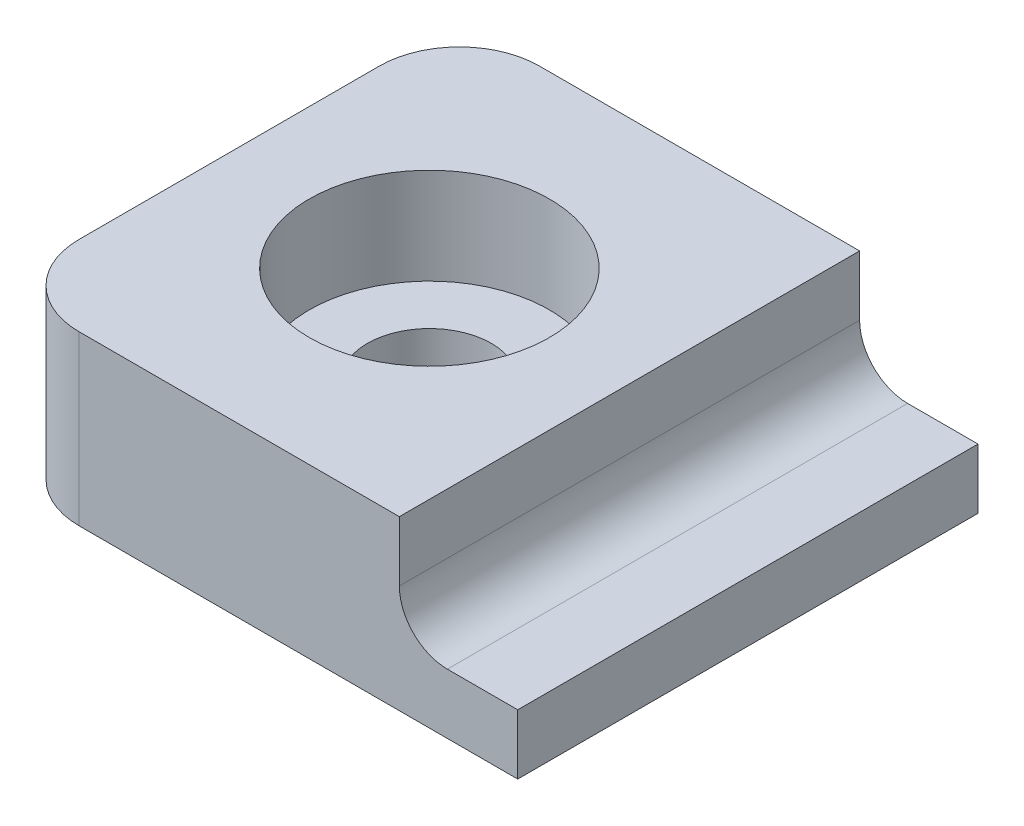
ISO-10303-21;
HEADER;
FILE_DESCRIPTION(('STEP AP214'),'2;1');
FILE_NAME('part.step','',(''),(''),'','','');
FILE_SCHEMA(('AUTOMOTIVE_DESIGN { 1 0 10303 214 1 1 1 1 }'));
ENDSEC;
DATA;
#1=APPLICATION_CONTEXT('core data for automotive mechanical design processes');
#2=APPLICATION_PROTOCOL_DEFINITION('international standard','automotive_design',2000,#1);
#3=PRODUCT_CONTEXT('',#1,'mechanical');
#4=PRODUCT('Part','Part','',(#3));
#5=PRODUCT_RELATED_PRODUCT_CATEGORY('part','',(#4));
#6=PRODUCT_DEFINITION_FORMATION('','',#4);
#7=PRODUCT_DEFINITION_CONTEXT('part definition',#1,'design');
#8=PRODUCT_DEFINITION('design','',#6,#7);
#9=PRODUCT_DEFINITION_SHAPE('','',#8);
#10=(LENGTH_UNIT() NAMED_UNIT(*) SI_UNIT(.MILLI.,.METRE.));
#11=(NAMED_UNIT(*) PLANE_ANGLE_UNIT() SI_UNIT($,.RADIAN.));
#12=(NAMED_UNIT(*) SI_UNIT($,.STERADIAN.) SOLID_ANGLE_UNIT());
#13=UNCERTAINTY_MEASURE_WITH_UNIT(LENGTH_MEASURE(1.E-05),#10,'distance_accuracy_value','');
#14=(GEOMETRIC_REPRESENTATION_CONTEXT(3) GLOBAL_UNCERTAINTY_ASSIGNED_CONTEXT((#13)) GLOBAL_UNIT_ASSIGNED_CONTEXT((#10,
#11,#12)) REPRESENTATION_CONTEXT('',''));
#15=CARTESIAN_POINT('',(0.,0.,0.));
#16=DIRECTION('',(0.,0.,1.));
#17=DIRECTION('',(1.,0.,0.));
#18=AXIS2_PLACEMENT_3D('',#15,#16,#17);
#19=CARTESIAN_POINT('',(-88.9,0.,0.));
#20=DIRECTION('',(0.,1.,0.));
#21=DIRECTION('',(0.,0.,1.));
#22=AXIS2_PLACEMENT_3D('',#19,#20,#21);
#23=CYLINDRICAL_SURFACE('',#22,7.62);
#24=CARTESIAN_POINT('',(-88.9,10.668,0.));
#25=DIRECTION('',(0.,1.,0.));
#26=DIRECTION('',(0.,0.,1.));
#27=AXIS2_PLACEMENT_3D('',#24,#25,#26);
#28=CIRCLE('',#27,7.62);
#29=CARTESIAN_POINT('',(-88.9,10.668,7.62));
#30=VERTEX_POINT('',#29);
#31=EDGE_CURVE('E125',#30,#30,#28,.T.);
#32=CARTESIAN_POINT('',(-88.9,4.572,0.));
#33=DIRECTION('',(0.,-1.,0.));
#34=DIRECTION('',(0.,0.,-1.));
#35=AXIS2_PLACEMENT_3D('',#32,#33,#34);
#36=CIRCLE('',#35,7.62);
#37=CARTESIAN_POINT('',(-88.9,4.572,7.62));
#38=VERTEX_POINT('',#37);
#39=EDGE_CURVE('E167',#38,#38,#36,.F.);
#40=CARTESIAN_POINT('',(-88.9,10.668,7.62));
#41=CARTESIAN_POINT('',(-88.9,10.6045,7.62));
#42=CARTESIAN_POINT('',(-88.9,10.541,7.62));
#43=CARTESIAN_POINT('',(-88.9,10.414,7.62));
#44=CARTESIAN_POINT('',(-88.9,10.3505,7.62));
#45=CARTESIAN_POINT('',(-88.9,10.2235,7.62));
#46=CARTESIAN_POINT('',(-88.9,10.16,7.62));
#47=CARTESIAN_POINT('',(-88.9,10.033,7.62));
#48=CARTESIAN_POINT('',(-88.9,9.9695,7.62));
#49=CARTESIAN_POINT('',(-88.9,9.8425,7.62));
#50=CARTESIAN_POINT('',(-88.9,9.779,7.62));
#51=CARTESIAN_POINT('',(-88.9,9.652,7.62));
#52=CARTESIAN_POINT('',(-88.9,9.5885,7.62));
#53=CARTESIAN_POINT('',(-88.9,9.4615,7.62));
#54=CARTESIAN_POINT('',(-88.9,9.398,7.62));
#55=CARTESIAN_POINT('',(-88.9,9.271,7.62));
#56=CARTESIAN_POINT('',(-88.9,9.2075,7.62));
#57=CARTESIAN_POINT('',(-88.9,9.0805,7.62));
#58=CARTESIAN_POINT('',(-88.9,9.017,7.62));
#59=CARTESIAN_POINT('',(-88.9,8.89,7.62));
#60=CARTESIAN_POINT('',(-88.9,8.8265,7.62));
#61=CARTESIAN_POINT('',(-88.9,8.6995,7.62));
#62=CARTESIAN_POINT('',(-88.9,8.636,7.62));
#63=CARTESIAN_POINT('',(-88.9,8.509,7.62));
#64=CARTESIAN_POINT('',(-88.9,8.4455,7.62));
#65=CARTESIAN_POINT('',(-88.9,8.3185,7.62));
#66=CARTESIAN_POINT('',(-88.9,8.255,7.62));
#67=CARTESIAN_POINT('',(-88.9,8.128,7.62));
#68=CARTESIAN_POINT('',(-88.9,8.0645,7.62));
#69=CARTESIAN_POINT('',(-88.9,7.9375,7.62));
#70=CARTESIAN_POINT('',(-88.9,7.874,7.62));
#71=CARTESIAN_POINT('',(-88.9,7.747,7.62));
#72=CARTESIAN_POINT('',(-88.9,7.6835,7.62));
#73=CARTESIAN_POINT('',(-88.9,7.5565,7.62));
#74=CARTESIAN_POINT('',(-88.9,7.493,7.62));
#75=CARTESIAN_POINT('',(-88.9,7.366,7.62));
#76=CARTESIAN_POINT('',(-88.9,7.3025,7.62));
#77=CARTESIAN_POINT('',(-88.9,7.1755,7.62));
#78=CARTESIAN_POINT('',(-88.9,7.112,7.62));
#79=CARTESIAN_POINT('',(-88.9,6.985,7.62));
#80=CARTESIAN_POINT('',(-88.9,6.9215,7.62));
#81=CARTESIAN_POINT('',(-88.9,6.7945,7.62));
#82=CARTESIAN_POINT('',(-88.9,6.731,7.62));
#83=CARTESIAN_POINT('',(-88.9,6.604,7.62));
#84=CARTESIAN_POINT('',(-88.9,6.5405,7.62));
#85=CARTESIAN_POINT('',(-88.9,6.4135,7.62));
#86=CARTESIAN_POINT('',(-88.9,6.35,7.62));
#87=CARTESIAN_POINT('',(-88.9,6.223,7.62));
#88=CARTESIAN_POINT('',(-88.9,6.1595,7.62));
#89=CARTESIAN_POINT('',(-88.9,6.0325,7.62));
#90=CARTESIAN_POINT('',(-88.9,5.969,7.62));
#91=CARTESIAN_POINT('',(-88.9,5.842,7.62));
#92=CARTESIAN_POINT('',(-88.9,5.7785,7.62));
#93=CARTESIAN_POINT('',(-88.9,5.6515,7.62));
#94=CARTESIAN_POINT('',(-88.9,5.588,7.62));
#95=CARTESIAN_POINT('',(-88.9,5.461,7.62));
#96=CARTESIAN_POINT('',(-88.9,5.3975,7.62));
#97=CARTESIAN_POINT('',(-88.9,5.2705,7.62));
#98=CARTESIAN_POINT('',(-88.9,5.207,7.62));
#99=CARTESIAN_POINT('',(-88.9,5.08,7.62));
#100=CARTESIAN_POINT('',(-88.9,5.0165,7.62));
#101=CARTESIAN_POINT('',(-88.9,4.8895,7.62));
#102=CARTESIAN_POINT('',(-88.9,4.826,7.62));
#103=CARTESIAN_POINT('',(-88.9,4.699,7.62));
#104=CARTESIAN_POINT('',(-88.9,4.6355,7.62));
#105=CARTESIAN_POINT('',(-88.9,4.572,7.62));
#106=B_SPLINE_CURVE_WITH_KNOTS('',3,(#40,#41,#42,#43,#44,#45,#46,#47,#48,#49,#50,#51,#52,#53,
#54,#55,#56,#57,#58,#59,#60,#61,#62,#63,#64,#65,#66,#67,#68,#69,#70,#71,#72,#73,#74,#75,#76,#77,
#78,#79,#80,#81,#82,#83,#84,#85,#86,#87,#88,#89,#90,#91,#92,#93,#94,#95,#96,#97,#98,#99,#100,
#101,#102,#103,#104,#105),.UNSPECIFIED.,.F.,.F.,(4,2,2,2,2,2,2,2,2,2,2,2,2,2,2,2,2,2,2,2,2,2,2,
2,2,2,2,2,2,2,2,2,4),(0.,0.1905,0.380999999999999,0.571499999999999,0.762000000000001,0.9525,
1.143,1.3335,1.524,1.7145,1.905,2.0955,2.286,2.4765,2.667,2.8575,3.048,3.2385,3.429,3.6195,3.81,
4.0005,4.191,4.3815,4.572,4.7625,4.953,5.1435,5.334,5.5245,5.715,5.9055,6.096),.UNSPECIFIED.);
#107=EDGE_CURVE('BSEAM37',#30,#38,#106,.T.);
#108=ORIENTED_EDGE('',*,*,#31,.T.);
#109=ORIENTED_EDGE('',*,*,#39,.F.);
#110=ORIENTED_EDGE('',*,*,#107,.T.);
#111=ORIENTED_EDGE('',*,*,#107,.F.);
#112=EDGE_LOOP('',(#108,#110,#109,#111));
#113=FACE_BOUND('',#112,.T.);
#114=ADVANCED_FACE('F37',(#113),#23,.F.);
#115=CARTESIAN_POINT('',(-96.52,0.,14.605));
#116=DIRECTION('',(0.,0.,1.));
#117=DIRECTION('',(1.,0.,0.));
#118=AXIS2_PLACEMENT_3D('',#115,#116,#117);
#119=PLANE('',#118);
#120=DIRECTION('',(0.,-1.,0.));
#121=VECTOR('',#120,1.);
#122=CARTESIAN_POINT('',(-68.6869056620506,12.1383970507649,14.605));
#123=LINE('',#122,#121);
#124=CARTESIAN_POINT('',(-68.6869056620506,3.81000000000001,14.605));
#125=VERTEX_POINT('',#124);
#126=CARTESIAN_POINT('',(-68.6869056620506,0.,14.605));
#127=VERTEX_POINT('',#126);
#128=EDGE_CURVE('E106',#125,#127,#123,.T.);
#129=ORIENTED_EDGE('',*,*,#128,.F.);
#130=DIRECTION('',(-1.,0.,0.));
#131=VECTOR('',#130,1.);
#132=CARTESIAN_POINT('',(0.,3.81000000000001,14.605));
#133=LINE('',#132,#131);
#134=CARTESIAN_POINT('',(-73.152,3.81000000000002,14.605));
#135=VERTEX_POINT('',#134);
#136=EDGE_CURVE('E113',#125,#135,#133,.T.);
#137=ORIENTED_EDGE('',*,*,#136,.T.);
#138=CARTESIAN_POINT('',(-73.152,6.85800000000002,14.605));
#139=DIRECTION('',(0.,0.,1.));
#140=DIRECTION('',(1.,0.,0.));
#141=AXIS2_PLACEMENT_3D('',#138,#139,#140);
#142=CIRCLE('',#141,3.048);
#143=CARTESIAN_POINT('',(-76.2,6.85800000000001,14.605));
#144=VERTEX_POINT('',#143);
#145=EDGE_CURVE('E45',#135,#144,#142,.F.);
#146=ORIENTED_EDGE('',*,*,#145,.T.);
#147=DIRECTION('',(0.,-1.,0.));
#148=VECTOR('',#147,1.);
#149=CARTESIAN_POINT('',(-76.2,-1.54197642309049E-13,14.605));
#150=LINE('',#149,#148);
#151=CARTESIAN_POINT('',(-76.2,10.668,14.605));
#152=VERTEX_POINT('',#151);
#153=EDGE_CURVE('E122',#152,#144,#150,.T.);
#154=ORIENTED_EDGE('',*,*,#153,.F.);
#155=DIRECTION('',(1.,0.,0.));
#156=VECTOR('',#155,1.);
#157=CARTESIAN_POINT('',(-96.52,10.668,14.605));
#158=LINE('',#157,#156);
#159=CARTESIAN_POINT('',(-96.52,10.668,14.605));
#160=VERTEX_POINT('',#159);
#161=EDGE_CURVE('E149',#160,#152,#158,.T.);
#162=ORIENTED_EDGE('',*,*,#161,.F.);
#163=DIRECTION('',(0.,1.,0.));
#164=VECTOR('',#163,1.);
#165=CARTESIAN_POINT('',(-96.52,0.,14.605));
#166=LINE('',#165,#164);
#167=CARTESIAN_POINT('',(-96.52,0.,14.605));
#168=VERTEX_POINT('',#167);
#169=EDGE_CURVE('E165',#168,#160,#166,.T.);
#170=ORIENTED_EDGE('',*,*,#169,.F.);
#171=DIRECTION('',(1.,0.,0.));
#172=VECTOR('',#171,1.);
#173=CARTESIAN_POINT('',(-96.52,0.,14.605));
#174=LINE('',#173,#172);
#175=EDGE_CURVE('E116',#168,#127,#174,.T.);
#176=ORIENTED_EDGE('',*,*,#175,.T.);
#177=EDGE_LOOP('',(#129,#137,#146,#154,#162,#170,#176));
#178=FACE_BOUND('',#177,.T.);
#179=ADVANCED_FACE('F112',(#178),#119,.T.);
#180=CARTESIAN_POINT('',(-96.52,0.,-14.605));
#181=DIRECTION('',(0.,0.,-1.));
#182=DIRECTION('',(-1.,0.,0.));
#183=AXIS2_PLACEMENT_3D('',#180,#181,#182);
#184=PLANE('',#183);
#185=DIRECTION('',(0.,-1.,0.));
#186=VECTOR('',#185,1.);
#187=CARTESIAN_POINT('',(-68.6869056620506,12.1383970507649,-14.605));
#188=LINE('',#187,#186);
#189=CARTESIAN_POINT('',(-68.6869056620506,3.81000000000002,-14.605));
#190=VERTEX_POINT('',#189);
#191=CARTESIAN_POINT('',(-68.6869056620506,0.,-14.605));
#192=VERTEX_POINT('',#191);
#193=EDGE_CURVE('E52',#190,#192,#188,.T.);
#194=ORIENTED_EDGE('',*,*,#193,.T.);
#195=DIRECTION('',(-1.,0.,0.));
#196=VECTOR('',#195,1.);
#197=CARTESIAN_POINT('',(-96.52,0.,-14.605));
#198=LINE('',#197,#196);
#199=CARTESIAN_POINT('',(-96.52,0.,-14.605));
#200=VERTEX_POINT('',#199);
#201=EDGE_CURVE('E152',#192,#200,#198,.T.);
#202=ORIENTED_EDGE('',*,*,#201,.T.);
#203=DIRECTION('',(0.,1.,0.));
#204=VECTOR('',#203,1.);
#205=CARTESIAN_POINT('',(-96.52,0.,-14.605));
#206=LINE('',#205,#204);
#207=CARTESIAN_POINT('',(-96.52,10.668,-14.605));
#208=VERTEX_POINT('',#207);
#209=EDGE_CURVE('E164',#200,#208,#206,.T.);
#210=ORIENTED_EDGE('',*,*,#209,.T.);
#211=DIRECTION('',(-1.,0.,0.));
#212=VECTOR('',#211,1.);
#213=CARTESIAN_POINT('',(-96.52,10.668,-14.605));
#214=LINE('',#213,#212);
#215=CARTESIAN_POINT('',(-76.2,10.668,-14.605));
#216=VERTEX_POINT('',#215);
#217=EDGE_CURVE('E138',#216,#208,#214,.T.);
#218=ORIENTED_EDGE('',*,*,#217,.F.);
#219=DIRECTION('',(0.,-1.,0.));
#220=VECTOR('',#219,1.);
#221=CARTESIAN_POINT('',(-76.2,-1.54197642309049E-13,-14.605));
#222=LINE('',#221,#220);
#223=CARTESIAN_POINT('',(-76.2,6.85800000000001,-14.605));
#224=VERTEX_POINT('',#223);
#225=EDGE_CURVE('E131',#216,#224,#222,.T.);
#226=ORIENTED_EDGE('',*,*,#225,.T.);
#227=CARTESIAN_POINT('',(-73.152,6.85800000000002,-14.605));
#228=DIRECTION('',(0.,0.,-1.));
#229=DIRECTION('',(-1.,0.,0.));
#230=AXIS2_PLACEMENT_3D('',#227,#228,#229);
#231=CIRCLE('',#230,3.048);
#232=CARTESIAN_POINT('',(-73.152,3.81000000000002,-14.605));
#233=VERTEX_POINT('',#232);
#234=EDGE_CURVE('E180',#224,#233,#231,.F.);
#235=ORIENTED_EDGE('',*,*,#234,.T.);
#236=DIRECTION('',(-1.,0.,0.));
#237=VECTOR('',#236,1.);
#238=CARTESIAN_POINT('',(0.,3.81000000000001,-14.605));
#239=LINE('',#238,#237);
#240=EDGE_CURVE('E127',#190,#233,#239,.T.);
#241=ORIENTED_EDGE('',*,*,#240,.F.);
#242=EDGE_LOOP('',(#194,#202,#210,#218,#226,#235,#241));
#243=FACE_BOUND('',#242,.T.);
#244=ADVANCED_FACE('F183',(#243),#184,.T.);
#245=CARTESIAN_POINT('',(96.52,10.668,-9.525));
#246=DIRECTION('',(0.,-1.,0.));
#247=DIRECTION('',(0.,0.,-1.));
#248=AXIS2_PLACEMENT_3D('',#245,#246,#247);
#249=PLANE('',#248);
#250=ORIENTED_EDGE('',*,*,#31,.F.);
#251=EDGE_LOOP('',(#250));
#252=FACE_BOUND('',#251,.T.);
#253=DIRECTION('',(0.,0.,-1.));
#254=VECTOR('',#253,1.);
#255=CARTESIAN_POINT('',(-76.2,10.668,14.605));
#256=LINE('',#255,#254);
#257=EDGE_CURVE('E121',#152,#216,#256,.T.);
#258=ORIENTED_EDGE('',*,*,#257,.T.);
#259=ORIENTED_EDGE('',*,*,#217,.T.);
#260=CARTESIAN_POINT('',(-96.52,10.668,-9.525));
#261=DIRECTION('',(0.,1.,0.));
#262=DIRECTION('',(0.,0.,-1.));
#263=AXIS2_PLACEMENT_3D('',#260,#261,#262);
#264=CIRCLE('',#263,5.08);
#265=CARTESIAN_POINT('',(-101.6,10.668,-9.525));
#266=VERTEX_POINT('',#265);
#267=EDGE_CURVE('E140',#208,#266,#264,.T.);
#268=ORIENTED_EDGE('',*,*,#267,.T.);
#269=DIRECTION('',(0.,0.,1.));
#270=VECTOR('',#269,1.);
#271=CARTESIAN_POINT('',(-101.6,10.668,9.525));
#272=LINE('',#271,#270);
#273=CARTESIAN_POINT('',(-101.6,10.668,9.525));
#274=VERTEX_POINT('',#273);
#275=EDGE_CURVE('E143',#266,#274,#272,.T.);
#276=ORIENTED_EDGE('',*,*,#275,.T.);
#277=CARTESIAN_POINT('',(-96.52,10.668,9.525));
#278=DIRECTION('',(0.,1.,0.));
#279=DIRECTION('',(0.,0.,-1.));
#280=AXIS2_PLACEMENT_3D('',#277,#278,#279);
#281=CIRCLE('',#280,5.08);
#282=EDGE_CURVE('E146',#274,#160,#281,.T.);
#283=ORIENTED_EDGE('',*,*,#282,.T.);
#284=ORIENTED_EDGE('',*,*,#161,.T.);
#285=EDGE_LOOP('',(#258,#259,#268,#276,#283,#284));
#286=FACE_BOUND('',#285,.T.);
#287=ADVANCED_FACE('F191',(#252,#286),#249,.F.);
#288=CARTESIAN_POINT('',(0.,0.,0.));
#289=DIRECTION('',(0.,1.,0.));
#290=DIRECTION('',(0.,0.,1.));
#291=AXIS2_PLACEMENT_3D('',#288,#289,#290);
#292=PLANE('',#291);
#293=ORIENTED_EDGE('',*,*,#201,.F.);
#294=DIRECTION('',(0.,0.,1.));
#295=VECTOR('',#294,1.);
#296=CARTESIAN_POINT('',(-68.6869056620506,0.,0.));
#297=LINE('',#296,#295);
#298=EDGE_CURVE('E202',#192,#127,#297,.T.);
#299=ORIENTED_EDGE('',*,*,#298,.T.);
#300=ORIENTED_EDGE('',*,*,#175,.F.);
#301=CARTESIAN_POINT('',(-96.52,0.,9.525));
#302=DIRECTION('',(0.,1.,0.));
#303=DIRECTION('',(0.,0.,-1.));
#304=AXIS2_PLACEMENT_3D('',#301,#302,#303);
#305=CIRCLE('',#304,5.08);
#306=CARTESIAN_POINT('',(-101.6,0.,9.525));
#307=VERTEX_POINT('',#306);
#308=EDGE_CURVE('E160',#307,#168,#305,.T.);
#309=ORIENTED_EDGE('',*,*,#308,.F.);
#310=DIRECTION('',(0.,0.,1.));
#311=VECTOR('',#310,1.);
#312=CARTESIAN_POINT('',(-101.6,0.,9.525));
#313=LINE('',#312,#311);
#314=CARTESIAN_POINT('',(-101.6,0.,-9.525));
#315=VERTEX_POINT('',#314);
#316=EDGE_CURVE('E157',#315,#307,#313,.T.);
#317=ORIENTED_EDGE('',*,*,#316,.F.);
#318=CARTESIAN_POINT('',(-96.52,0.,-9.525));
#319=DIRECTION('',(0.,1.,0.));
#320=DIRECTION('',(0.,0.,-1.));
#321=AXIS2_PLACEMENT_3D('',#318,#319,#320);
#322=CIRCLE('',#321,5.08);
#323=EDGE_CURVE('E154',#200,#315,#322,.T.);
#324=ORIENTED_EDGE('',*,*,#323,.F.);
#325=EDGE_LOOP('',(#293,#299,#300,#309,#317,#324));
#326=FACE_BOUND('',#325,.T.);
#327=CARTESIAN_POINT('',(-88.9,0.,0.));
#328=DIRECTION('',(0.,-1.,0.));
#329=DIRECTION('',(0.,0.,-1.));
#330=AXIS2_PLACEMENT_3D('',#327,#328,#329);
#331=CIRCLE('',#330,3.937);
#332=CARTESIAN_POINT('',(-88.9,0.,-3.937));
#333=VERTEX_POINT('',#332);
#334=EDGE_CURVE('E204',#333,#333,#331,.T.);
#335=ORIENTED_EDGE('',*,*,#334,.F.);
#336=EDGE_LOOP('',(#335));
#337=FACE_BOUND('',#336,.T.);
#338=ADVANCED_FACE('F199',(#326,#337),#292,.F.);
#339=CARTESIAN_POINT('',(-96.52,0.,9.525));
#340=DIRECTION('',(0.,1.,0.));
#341=DIRECTION('',(0.,0.,1.));
#342=AXIS2_PLACEMENT_3D('',#339,#340,#341);
#343=CYLINDRICAL_SURFACE('',#342,5.08);
#344=ORIENTED_EDGE('',*,*,#169,.T.);
#345=ORIENTED_EDGE('',*,*,#282,.F.);
#346=DIRECTION('',(0.,1.,0.));
#347=VECTOR('',#346,1.);
#348=CARTESIAN_POINT('',(-101.6,0.,9.525));
#349=LINE('',#348,#347);
#350=EDGE_CURVE('E168',#307,#274,#349,.T.);
#351=ORIENTED_EDGE('',*,*,#350,.F.);
#352=ORIENTED_EDGE('',*,*,#308,.T.);
#353=EDGE_LOOP('',(#344,#345,#351,#352));
#354=FACE_BOUND('',#353,.T.);
#355=ADVANCED_FACE('F195',(#354),#343,.T.);
#356=CARTESIAN_POINT('',(-101.6,0.,9.525));
#357=DIRECTION('',(-1.,0.,0.));
#358=DIRECTION('',(0.,0.,1.));
#359=AXIS2_PLACEMENT_3D('',#356,#357,#358);
#360=PLANE('',#359);
#361=ORIENTED_EDGE('',*,*,#350,.T.);
#362=ORIENTED_EDGE('',*,*,#275,.F.);
#363=DIRECTION('',(0.,1.,0.));
#364=VECTOR('',#363,1.);
#365=CARTESIAN_POINT('',(-101.6,0.,-9.525));
#366=LINE('',#365,#364);
#367=EDGE_CURVE('E170',#315,#266,#366,.T.);
#368=ORIENTED_EDGE('',*,*,#367,.F.);
#369=ORIENTED_EDGE('',*,*,#316,.T.);
#370=EDGE_LOOP('',(#361,#362,#368,#369));
#371=FACE_BOUND('',#370,.T.);
#372=ADVANCED_FACE('F225',(#371),#360,.T.);
#373=CARTESIAN_POINT('',(-96.52,0.,-9.525));
#374=DIRECTION('',(0.,1.,0.));
#375=DIRECTION('',(0.,0.,1.));
#376=AXIS2_PLACEMENT_3D('',#373,#374,#375);
#377=CYLINDRICAL_SURFACE('',#376,5.08);
#378=ORIENTED_EDGE('',*,*,#367,.T.);
#379=ORIENTED_EDGE('',*,*,#267,.F.);
#380=ORIENTED_EDGE('',*,*,#209,.F.);
#381=ORIENTED_EDGE('',*,*,#323,.T.);
#382=EDGE_LOOP('',(#378,#379,#380,#381));
#383=FACE_BOUND('',#382,.T.);
#384=ADVANCED_FACE('F242',(#383),#377,.T.);
#385=CARTESIAN_POINT('',(-76.2,-1.54197642309049E-13,14.605));
#386=DIRECTION('',(1.,0.,0.));
#387=DIRECTION('',(0.,1.,0.));
#388=AXIS2_PLACEMENT_3D('',#385,#386,#387);
#389=PLANE('',#388);
#390=ORIENTED_EDGE('',*,*,#153,.T.);
#391=DIRECTION('',(0.,0.,-1.));
#392=VECTOR('',#391,1.);
#393=CARTESIAN_POINT('',(-76.2,6.85800000000001,14.605));
#394=LINE('',#393,#392);
#395=EDGE_CURVE('E177',#144,#224,#394,.T.);
#396=ORIENTED_EDGE('',*,*,#395,.T.);
#397=ORIENTED_EDGE('',*,*,#225,.F.);
#398=ORIENTED_EDGE('',*,*,#257,.F.);
#399=EDGE_LOOP('',(#390,#396,#397,#398));
#400=FACE_BOUND('',#399,.T.);
#401=ADVANCED_FACE('F188',(#400),#389,.T.);
#402=CARTESIAN_POINT('',(0.,3.81000000000001,14.605));
#403=DIRECTION('',(0.,-1.,0.));
#404=DIRECTION('',(1.,0.,0.));
#405=AXIS2_PLACEMENT_3D('',#402,#403,#404);
#406=PLANE('',#405);
#407=ORIENTED_EDGE('',*,*,#136,.F.);
#408=DIRECTION('',(0.,0.,-1.));
#409=VECTOR('',#408,1.);
#410=CARTESIAN_POINT('',(-68.6869056620506,3.81000000000002,14.605));
#411=LINE('',#410,#409);
#412=EDGE_CURVE('E11',#125,#190,#411,.T.);
#413=ORIENTED_EDGE('',*,*,#412,.T.);
#414=ORIENTED_EDGE('',*,*,#240,.T.);
#415=DIRECTION('',(0.,0.,-1.));
#416=VECTOR('',#415,1.);
#417=CARTESIAN_POINT('',(-73.152,3.81000000000002,14.605));
#418=LINE('',#417,#416);
#419=EDGE_CURVE('E120',#233,#135,#418,.F.);
#420=ORIENTED_EDGE('',*,*,#419,.T.);
#421=EDGE_LOOP('',(#407,#413,#414,#420));
#422=FACE_BOUND('',#421,.T.);
#423=ADVANCED_FACE('F118',(#422),#406,.F.);
#424=CARTESIAN_POINT('',(-88.9,4.572,0.));
#425=DIRECTION('',(0.,-1.,0.));
#426=DIRECTION('',(0.,0.,-1.));
#427=AXIS2_PLACEMENT_3D('',#424,#425,#426);
#428=PLANE('',#427);
#429=CARTESIAN_POINT('',(-88.9,4.572,0.));
#430=DIRECTION('',(0.,-1.,0.));
#431=DIRECTION('',(0.,0.,-1.));
#432=AXIS2_PLACEMENT_3D('',#429,#430,#431);
#433=CIRCLE('',#432,3.937);
#434=CARTESIAN_POINT('',(-88.9,4.572,-3.937));
#435=VERTEX_POINT('',#434);
#436=EDGE_CURVE('E134',#435,#435,#433,.T.);
#437=ORIENTED_EDGE('',*,*,#436,.T.);
#438=EDGE_LOOP('',(#437));
#439=FACE_BOUND('',#438,.T.);
#440=ORIENTED_EDGE('',*,*,#39,.T.);
#441=EDGE_LOOP('',(#440));
#442=FACE_BOUND('',#441,.T.);
#443=ADVANCED_FACE('F212',(#439,#442),#428,.F.);
#444=CARTESIAN_POINT('',(-88.9,4.572,0.));
#445=DIRECTION('',(0.,-1.,0.));
#446=DIRECTION('',(0.,0.,-1.));
#447=AXIS2_PLACEMENT_3D('',#444,#445,#446);
#448=CYLINDRICAL_SURFACE('',#447,3.937);
#449=ORIENTED_EDGE('',*,*,#436,.F.);
#450=EDGE_LOOP('',(#449));
#451=FACE_BOUND('',#450,.T.);
#452=ORIENTED_EDGE('',*,*,#334,.T.);
#453=EDGE_LOOP('',(#452));
#454=FACE_BOUND('',#453,.T.);
#455=ADVANCED_FACE('F215',(#451,#454),#448,.F.);
#456=CARTESIAN_POINT('',(-73.152,6.85800000000002,14.605));
#457=DIRECTION('',(0.,0.,-1.));
#458=DIRECTION('',(-1.,0.,0.));
#459=AXIS2_PLACEMENT_3D('',#456,#457,#458);
#460=CYLINDRICAL_SURFACE('',#459,3.048);
#461=ORIENTED_EDGE('',*,*,#145,.F.);
#462=ORIENTED_EDGE('',*,*,#419,.F.);
#463=ORIENTED_EDGE('',*,*,#234,.F.);
#464=ORIENTED_EDGE('',*,*,#395,.F.);
#465=EDGE_LOOP('',(#461,#462,#463,#464));
#466=FACE_BOUND('',#465,.T.);
#467=ADVANCED_FACE('F39',(#466),#460,.F.);
#468=CARTESIAN_POINT('',(-68.6869056620506,12.1383970507649,-14.605));
#469=DIRECTION('',(-1.,0.,0.));
#470=DIRECTION('',(0.,0.,1.));
#471=AXIS2_PLACEMENT_3D('',#468,#469,#470);
#472=PLANE('',#471);
#473=ORIENTED_EDGE('',*,*,#193,.F.);
#474=ORIENTED_EDGE('',*,*,#412,.F.);
#475=ORIENTED_EDGE('',*,*,#128,.T.);
#476=ORIENTED_EDGE('',*,*,#298,.F.);
#477=EDGE_LOOP('',(#473,#474,#475,#476));
#478=FACE_BOUND('',#477,.T.);
#479=ADVANCED_FACE('F105',(#478),#472,.F.);
#480=CLOSED_SHELL('',(#114,#179,#244,#287,#338,#355,#372,#384,#401,#423,#443,#455,#467,#479));
#481=MANIFOLD_SOLID_BREP('B2',#480);
#482=ADVANCED_BREP_SHAPE_REPRESENTATION('',(#18,#481),#14);
#483=SHAPE_DEFINITION_REPRESENTATION(#9,#482);
ENDSEC;
END-ISO-10303-21;
